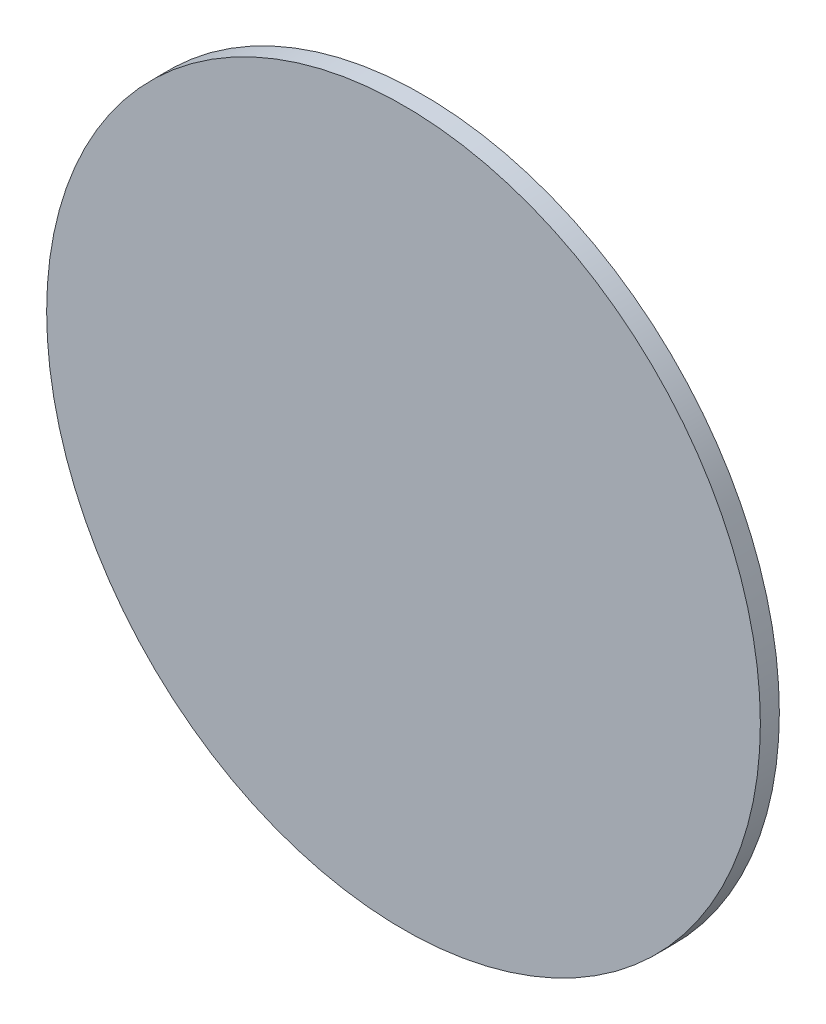
ISO-10303-21;
HEADER;
FILE_DESCRIPTION(('STEP AP214'),'2;1');
FILE_NAME('part.step','',(''),(''),'','','');
FILE_SCHEMA(('AUTOMOTIVE_DESIGN { 1 0 10303 214 1 1 1 1 }'));
ENDSEC;
DATA;
#1=APPLICATION_CONTEXT('core data for automotive mechanical design processes');
#2=APPLICATION_PROTOCOL_DEFINITION('international standard','automotive_design',2000,#1);
#3=PRODUCT_CONTEXT('',#1,'mechanical');
#4=PRODUCT('Part','Part','',(#3));
#5=PRODUCT_RELATED_PRODUCT_CATEGORY('part','',(#4));
#6=PRODUCT_DEFINITION_FORMATION('','',#4);
#7=PRODUCT_DEFINITION_CONTEXT('part definition',#1,'design');
#8=PRODUCT_DEFINITION('design','',#6,#7);
#9=PRODUCT_DEFINITION_SHAPE('','',#8);
#10=(LENGTH_UNIT() NAMED_UNIT(*) SI_UNIT(.MILLI.,.METRE.));
#11=(NAMED_UNIT(*) PLANE_ANGLE_UNIT() SI_UNIT($,.RADIAN.));
#12=(NAMED_UNIT(*) SI_UNIT($,.STERADIAN.) SOLID_ANGLE_UNIT());
#13=UNCERTAINTY_MEASURE_WITH_UNIT(LENGTH_MEASURE(1.E-05),#10,'distance_accuracy_value','');
#14=(GEOMETRIC_REPRESENTATION_CONTEXT(3) GLOBAL_UNCERTAINTY_ASSIGNED_CONTEXT((#13)) GLOBAL_UNIT_ASSIGNED_CONTEXT((#10,
#11,#12)) REPRESENTATION_CONTEXT('',''));
#15=CARTESIAN_POINT('',(0.,0.,0.));
#16=DIRECTION('',(0.,0.,1.));
#17=DIRECTION('',(1.,0.,0.));
#18=AXIS2_PLACEMENT_3D('',#15,#16,#17);
#19=CARTESIAN_POINT('',(0.,0.,1.));
#20=DIRECTION('',(0.,0.,-1.));
#21=DIRECTION('',(-1.,0.,0.));
#22=AXIS2_PLACEMENT_3D('',#19,#20,#21);
#23=CYLINDRICAL_SURFACE('',#22,18.8);
#24=CARTESIAN_POINT('',(0.,0.,1.));
#25=DIRECTION('',(0.,0.,1.));
#26=DIRECTION('',(1.,0.,0.));
#27=AXIS2_PLACEMENT_3D('',#24,#25,#26);
#28=CIRCLE('',#27,18.8);
#29=CARTESIAN_POINT('',(18.8,0.,1.));
#30=VERTEX_POINT('',#29);
#31=EDGE_CURVE('E10',#30,#30,#28,.T.);
#32=ORIENTED_EDGE('',*,*,#31,.F.);
#33=EDGE_LOOP('',(#32));
#34=FACE_BOUND('',#33,.T.);
#35=CARTESIAN_POINT('',(0.,0.,0.));
#36=DIRECTION('',(0.,0.,1.));
#37=DIRECTION('',(1.,0.,0.));
#38=AXIS2_PLACEMENT_3D('',#35,#36,#37);
#39=CIRCLE('',#38,18.8);
#40=CARTESIAN_POINT('',(18.8,0.,0.));
#41=VERTEX_POINT('',#40);
#42=EDGE_CURVE('E36',#41,#41,#39,.T.);
#43=ORIENTED_EDGE('',*,*,#42,.T.);
#44=EDGE_LOOP('',(#43));
#45=FACE_BOUND('',#44,.T.);
#46=ADVANCED_FACE('F33',(#34,#45),#23,.T.);
#47=CARTESIAN_POINT('',(0.,0.,1.));
#48=DIRECTION('',(0.,0.,1.));
#49=DIRECTION('',(1.,0.,0.));
#50=AXIS2_PLACEMENT_3D('',#47,#48,#49);
#51=PLANE('',#50);
#52=ORIENTED_EDGE('',*,*,#31,.T.);
#53=EDGE_LOOP('',(#52));
#54=FACE_BOUND('',#53,.T.);
#55=ADVANCED_FACE('F48',(#54),#51,.T.);
#56=CARTESIAN_POINT('',(0.,0.,0.));
#57=DIRECTION('',(0.,0.,1.));
#58=DIRECTION('',(1.,0.,0.));
#59=AXIS2_PLACEMENT_3D('',#56,#57,#58);
#60=PLANE('',#59);
#61=ORIENTED_EDGE('',*,*,#42,.F.);
#62=EDGE_LOOP('',(#61));
#63=FACE_BOUND('',#62,.T.);
#64=ADVANCED_FACE('F46',(#63),#60,.F.);
#65=CLOSED_SHELL('',(#46,#55,#64));
#66=MANIFOLD_SOLID_BREP('B2',#65);
#67=ADVANCED_BREP_SHAPE_REPRESENTATION('',(#18,#66),#14);
#68=SHAPE_DEFINITION_REPRESENTATION(#9,#67);
ENDSEC;
END-ISO-10303-21;
